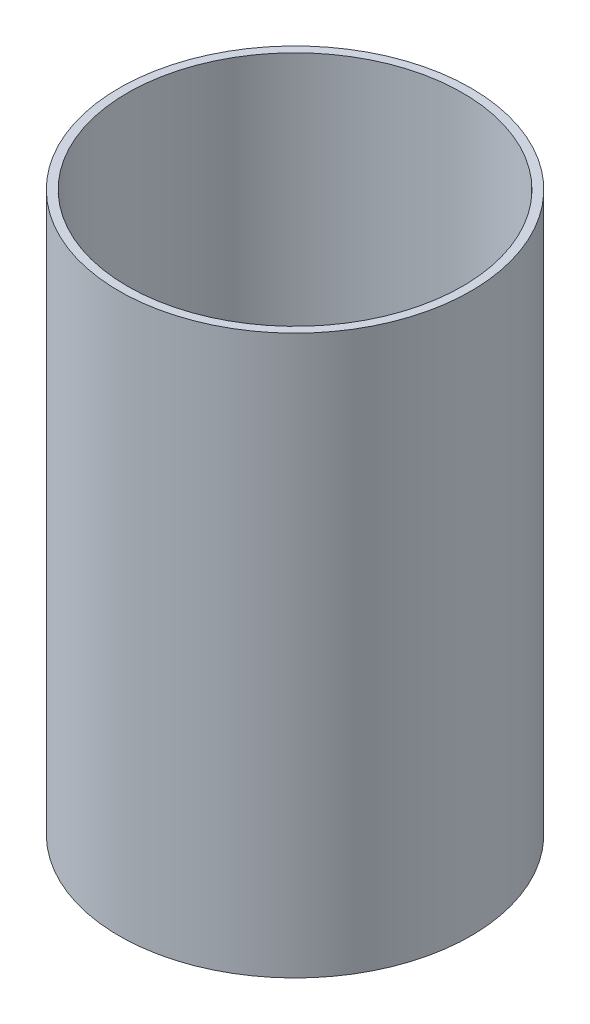
ISO-10303-21;
HEADER;
FILE_DESCRIPTION(('STEP AP214'),'2;1');
FILE_NAME('part.step','',(''),(''),'','','');
FILE_SCHEMA(('AUTOMOTIVE_DESIGN { 1 0 10303 214 1 1 1 1 }'));
ENDSEC;
DATA;
#1=APPLICATION_CONTEXT('core data for automotive mechanical design processes');
#2=APPLICATION_PROTOCOL_DEFINITION('international standard','automotive_design',2000,#1);
#3=PRODUCT_CONTEXT('',#1,'mechanical');
#4=PRODUCT('Part','Part','',(#3));
#5=PRODUCT_RELATED_PRODUCT_CATEGORY('part','',(#4));
#6=PRODUCT_DEFINITION_FORMATION('','',#4);
#7=PRODUCT_DEFINITION_CONTEXT('part definition',#1,'design');
#8=PRODUCT_DEFINITION('design','',#6,#7);
#9=PRODUCT_DEFINITION_SHAPE('','',#8);
#10=(LENGTH_UNIT() NAMED_UNIT(*) SI_UNIT(.MILLI.,.METRE.));
#11=(NAMED_UNIT(*) PLANE_ANGLE_UNIT() SI_UNIT($,.RADIAN.));
#12=(NAMED_UNIT(*) SI_UNIT($,.STERADIAN.) SOLID_ANGLE_UNIT());
#13=UNCERTAINTY_MEASURE_WITH_UNIT(LENGTH_MEASURE(1.E-05),#10,'distance_accuracy_value','');
#14=(GEOMETRIC_REPRESENTATION_CONTEXT(3) GLOBAL_UNCERTAINTY_ASSIGNED_CONTEXT((#13)) GLOBAL_UNIT_ASSIGNED_CONTEXT((#10,
#11,#12)) REPRESENTATION_CONTEXT('',''));
#15=CARTESIAN_POINT('',(0.,0.,0.));
#16=DIRECTION('',(0.,0.,1.));
#17=DIRECTION('',(1.,0.,0.));
#18=AXIS2_PLACEMENT_3D('',#15,#16,#17);
#19=CARTESIAN_POINT('',(0.,0.,0.));
#20=DIRECTION('',(0.,1.,0.));
#21=DIRECTION('',(0.,0.,1.));
#22=AXIS2_PLACEMENT_3D('',#19,#20,#21);
#23=CYLINDRICAL_SURFACE('',#22,30.);
#24=CARTESIAN_POINT('',(0.,100.,0.));
#25=DIRECTION('',(0.,1.,0.));
#26=DIRECTION('',(0.,0.,1.));
#27=AXIS2_PLACEMENT_3D('',#24,#25,#26);
#28=CIRCLE('',#27,30.);
#29=CARTESIAN_POINT('',(0.,100.,30.));
#30=VERTEX_POINT('',#29);
#31=EDGE_CURVE('E18',#30,#30,#28,.F.);
#32=ORIENTED_EDGE('',*,*,#31,.F.);
#33=EDGE_LOOP('',(#32));
#34=FACE_BOUND('',#33,.T.);
#35=CARTESIAN_POINT('',(0.,0.,0.));
#36=DIRECTION('',(0.,1.,0.));
#37=DIRECTION('',(0.,0.,1.));
#38=AXIS2_PLACEMENT_3D('',#35,#36,#37);
#39=CIRCLE('',#38,30.);
#40=CARTESIAN_POINT('',(0.,0.,30.));
#41=VERTEX_POINT('',#40);
#42=EDGE_CURVE('E30',#41,#41,#39,.T.);
#43=ORIENTED_EDGE('',*,*,#42,.F.);
#44=EDGE_LOOP('',(#43));
#45=FACE_BOUND('',#44,.T.);
#46=ADVANCED_FACE('F14',(#34,#45),#23,.F.);
#47=CARTESIAN_POINT('',(-31.51,100.,-31.51));
#48=DIRECTION('',(0.,1.,0.));
#49=DIRECTION('',(0.,0.,1.));
#50=AXIS2_PLACEMENT_3D('',#47,#48,#49);
#51=PLANE('',#50);
#52=ORIENTED_EDGE('',*,*,#31,.T.);
#53=EDGE_LOOP('',(#52));
#54=FACE_BOUND('',#53,.T.);
#55=CARTESIAN_POINT('',(0.,100.,0.));
#56=DIRECTION('',(0.,-1.,0.));
#57=DIRECTION('',(0.,0.,-1.));
#58=AXIS2_PLACEMENT_3D('',#55,#56,#57);
#59=CIRCLE('',#58,31.5);
#60=CARTESIAN_POINT('',(0.,100.,-31.5));
#61=VERTEX_POINT('',#60);
#62=EDGE_CURVE('E23',#61,#61,#59,.T.);
#63=ORIENTED_EDGE('',*,*,#62,.F.);
#64=EDGE_LOOP('',(#63));
#65=FACE_BOUND('',#64,.T.);
#66=ADVANCED_FACE('F40',(#54,#65),#51,.T.);
#67=CARTESIAN_POINT('',(-31.51,0.,31.51));
#68=DIRECTION('',(0.,-1.,0.));
#69=DIRECTION('',(0.,0.,-1.));
#70=AXIS2_PLACEMENT_3D('',#67,#68,#69);
#71=PLANE('',#70);
#72=ORIENTED_EDGE('',*,*,#42,.T.);
#73=EDGE_LOOP('',(#72));
#74=FACE_BOUND('',#73,.T.);
#75=CARTESIAN_POINT('',(0.,0.,0.));
#76=DIRECTION('',(0.,-1.,0.));
#77=DIRECTION('',(0.,0.,-1.));
#78=AXIS2_PLACEMENT_3D('',#75,#76,#77);
#79=CIRCLE('',#78,31.5);
#80=CARTESIAN_POINT('',(0.,0.,-31.5));
#81=VERTEX_POINT('',#80);
#82=EDGE_CURVE('E10',#81,#81,#79,.F.);
#83=ORIENTED_EDGE('',*,*,#82,.F.);
#84=EDGE_LOOP('',(#83));
#85=FACE_BOUND('',#84,.T.);
#86=ADVANCED_FACE('F50',(#74,#85),#71,.T.);
#87=CARTESIAN_POINT('',(0.,100.,0.));
#88=DIRECTION('',(0.,-1.,0.));
#89=DIRECTION('',(0.,0.,-1.));
#90=AXIS2_PLACEMENT_3D('',#87,#88,#89);
#91=CYLINDRICAL_SURFACE('',#90,31.5);
#92=ORIENTED_EDGE('',*,*,#82,.T.);
#93=EDGE_LOOP('',(#92));
#94=FACE_BOUND('',#93,.T.);
#95=ORIENTED_EDGE('',*,*,#62,.T.);
#96=EDGE_LOOP('',(#95));
#97=FACE_BOUND('',#96,.T.);
#98=ADVANCED_FACE('F16',(#94,#97),#91,.T.);
#99=CLOSED_SHELL('',(#46,#66,#86,#98));
#100=MANIFOLD_SOLID_BREP('B1',#99);
#101=ADVANCED_BREP_SHAPE_REPRESENTATION('',(#18,#100),#14);
#102=SHAPE_DEFINITION_REPRESENTATION(#9,#101);
ENDSEC;
END-ISO-10303-21;
